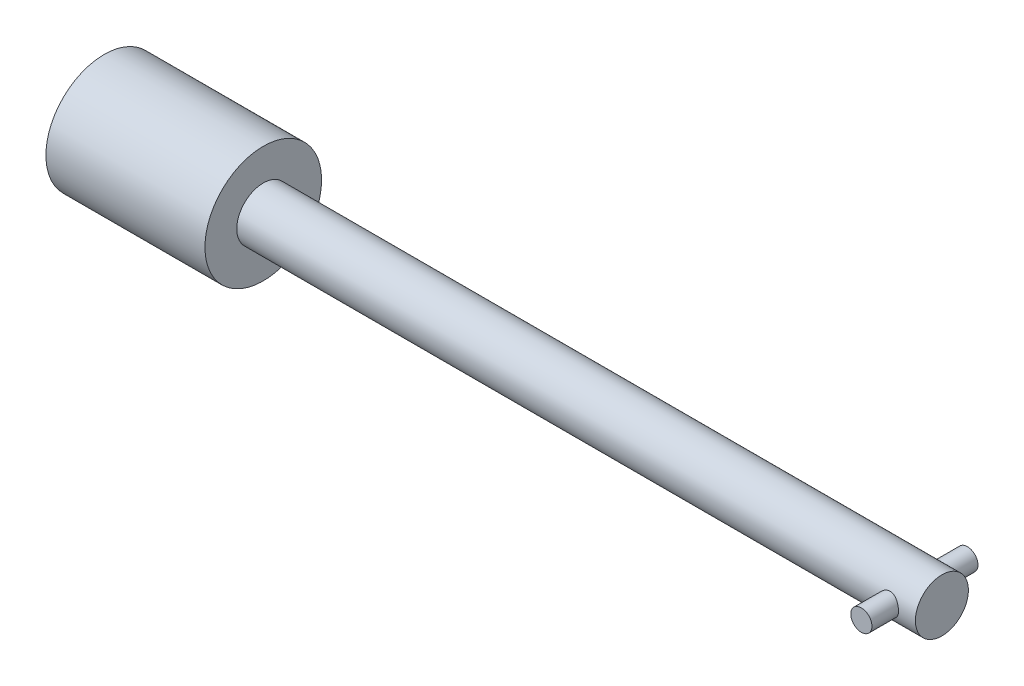
ISO-10303-21;
HEADER;
FILE_DESCRIPTION(('STEP AP214'),'2;1');
FILE_NAME('part.step','',(''),(''),'','','');
FILE_SCHEMA(('AUTOMOTIVE_DESIGN { 1 0 10303 214 1 1 1 1 }'));
ENDSEC;
DATA;
#1=APPLICATION_CONTEXT('core data for automotive mechanical design processes');
#2=APPLICATION_PROTOCOL_DEFINITION('international standard','automotive_design',2000,#1);
#3=PRODUCT_CONTEXT('',#1,'mechanical');
#4=PRODUCT('Part','Part','',(#3));
#5=PRODUCT_RELATED_PRODUCT_CATEGORY('part','',(#4));
#6=PRODUCT_DEFINITION_FORMATION('','',#4);
#7=PRODUCT_DEFINITION_CONTEXT('part definition',#1,'design');
#8=PRODUCT_DEFINITION('design','',#6,#7);
#9=PRODUCT_DEFINITION_SHAPE('','',#8);
#10=(LENGTH_UNIT() NAMED_UNIT(*) SI_UNIT(.MILLI.,.METRE.));
#11=(NAMED_UNIT(*) PLANE_ANGLE_UNIT() SI_UNIT($,.RADIAN.));
#12=(NAMED_UNIT(*) SI_UNIT($,.STERADIAN.) SOLID_ANGLE_UNIT());
#13=UNCERTAINTY_MEASURE_WITH_UNIT(LENGTH_MEASURE(1.E-05),#10,'distance_accuracy_value','');
#14=(GEOMETRIC_REPRESENTATION_CONTEXT(3) GLOBAL_UNCERTAINTY_ASSIGNED_CONTEXT((#13)) GLOBAL_UNIT_ASSIGNED_CONTEXT((#10,
#11,#12)) REPRESENTATION_CONTEXT('',''));
#15=CARTESIAN_POINT('',(0.,0.,0.));
#16=DIRECTION('',(0.,0.,1.));
#17=DIRECTION('',(1.,0.,0.));
#18=AXIS2_PLACEMENT_3D('',#15,#16,#17);
#19=CARTESIAN_POINT('',(15.,0.,0.));
#20=DIRECTION('',(-1.,0.,0.));
#21=DIRECTION('',(0.,0.,1.));
#22=AXIS2_PLACEMENT_3D('',#19,#20,#21);
#23=CYLINDRICAL_SURFACE('',#22,5.5);
#24=CARTESIAN_POINT('',(15.,0.,0.));
#25=DIRECTION('',(1.,0.,0.));
#26=DIRECTION('',(0.,0.,-1.));
#27=AXIS2_PLACEMENT_3D('',#24,#25,#26);
#28=CIRCLE('',#27,5.5);
#29=CARTESIAN_POINT('',(15.,0.,-5.5));
#30=VERTEX_POINT('',#29);
#31=EDGE_CURVE('E10',#30,#30,#28,.T.);
#32=ORIENTED_EDGE('',*,*,#31,.F.);
#33=EDGE_LOOP('',(#32));
#34=FACE_BOUND('',#33,.T.);
#35=CARTESIAN_POINT('',(0.,0.,0.));
#36=DIRECTION('',(1.,0.,0.));
#37=DIRECTION('',(0.,0.,-1.));
#38=AXIS2_PLACEMENT_3D('',#35,#36,#37);
#39=CIRCLE('',#38,5.5);
#40=CARTESIAN_POINT('',(0.,0.,-5.5));
#41=VERTEX_POINT('',#40);
#42=EDGE_CURVE('E42',#41,#41,#39,.T.);
#43=ORIENTED_EDGE('',*,*,#42,.T.);
#44=EDGE_LOOP('',(#43));
#45=FACE_BOUND('',#44,.T.);
#46=ADVANCED_FACE('F31',(#34,#45),#23,.T.);
#47=CARTESIAN_POINT('',(15.,0.,0.));
#48=DIRECTION('',(1.,0.,0.));
#49=DIRECTION('',(0.,0.,-1.));
#50=AXIS2_PLACEMENT_3D('',#47,#48,#49);
#51=PLANE('',#50);
#52=CARTESIAN_POINT('',(15.,0.,0.));
#53=DIRECTION('',(1.,0.,0.));
#54=DIRECTION('',(0.,0.,-1.));
#55=AXIS2_PLACEMENT_3D('',#52,#53,#54);
#56=CIRCLE('',#55,2.5);
#57=CARTESIAN_POINT('',(15.,0.,-2.5));
#58=VERTEX_POINT('',#57);
#59=EDGE_CURVE('E50',#58,#58,#56,.T.);
#60=ORIENTED_EDGE('',*,*,#59,.F.);
#61=EDGE_LOOP('',(#60));
#62=FACE_BOUND('',#61,.T.);
#63=ORIENTED_EDGE('',*,*,#31,.T.);
#64=EDGE_LOOP('',(#63));
#65=FACE_BOUND('',#64,.T.);
#66=ADVANCED_FACE('F89',(#62,#65),#51,.T.);
#67=CARTESIAN_POINT('',(0.,0.,0.));
#68=DIRECTION('',(1.,0.,0.));
#69=DIRECTION('',(0.,0.,-1.));
#70=AXIS2_PLACEMENT_3D('',#67,#68,#69);
#71=PLANE('',#70);
#72=CARTESIAN_POINT('',(0.,0.,0.));
#73=DIRECTION('',(-1.,0.,0.));
#74=DIRECTION('',(0.,0.,1.));
#75=AXIS2_PLACEMENT_3D('',#72,#73,#74);
#76=CIRCLE('',#75,2.5);
#77=CARTESIAN_POINT('',(0.,0.,2.5));
#78=VERTEX_POINT('',#77);
#79=EDGE_CURVE('E104',#78,#78,#76,.T.);
#80=ORIENTED_EDGE('',*,*,#79,.F.);
#81=EDGE_LOOP('',(#80));
#82=FACE_BOUND('',#81,.T.);
#83=ORIENTED_EDGE('',*,*,#42,.F.);
#84=EDGE_LOOP('',(#83));
#85=FACE_BOUND('',#84,.T.);
#86=ADVANCED_FACE('F85',(#82,#85),#71,.F.);
#87=CARTESIAN_POINT('',(79.,0.,0.));
#88=DIRECTION('',(-1.,0.,0.));
#89=DIRECTION('',(0.,0.,1.));
#90=AXIS2_PLACEMENT_3D('',#87,#88,#89);
#91=CYLINDRICAL_SURFACE('',#90,2.5);
#92=CARTESIAN_POINT('',(77.4052586538018,0.,2.5));
#93=CARTESIAN_POINT('',(77.4052537278899,-0.0537465027214461,2.49999635613542));
#94=CARTESIAN_POINT('',(77.4008997777576,-0.107586282045338,2.49824647153466));
#95=CARTESIAN_POINT('',(77.3836348020411,-0.213748240208949,2.49141726550321));
#96=CARTESIAN_POINT('',(77.3707005142587,-0.266065888780624,2.48632889349439));
#97=CARTESIAN_POINT('',(77.3368206147723,-0.367476961363702,2.47337104606559));
#98=CARTESIAN_POINT('',(77.3159012306934,-0.416580330808481,2.46551068182036));
#99=CARTESIAN_POINT('',(77.2667490671385,-0.510535985164184,2.44778305398039));
#100=CARTESIAN_POINT('',(77.2385188263423,-0.555389738375494,2.43791648729028));
#101=CARTESIAN_POINT('',(77.1741409045213,-0.641750503785193,2.41665443085209));
#102=CARTESIAN_POINT('',(77.1377053256816,-0.683031136275103,2.40521148464595));
#103=CARTESIAN_POINT('',(77.0585586520634,-0.759087502392358,2.38230288453097));
#104=CARTESIAN_POINT('',(77.0158445051959,-0.793860053566764,2.37083722226896));
#105=CARTESIAN_POINT('',(76.9230446186806,-0.857437283646437,2.34861395898568));
#106=CARTESIAN_POINT('',(76.8727154107902,-0.885907490597732,2.33791057982476));
#107=CARTESIAN_POINT('',(76.7674904545918,-0.933877359518572,2.31916823593396));
#108=CARTESIAN_POINT('',(76.7125968898776,-0.953381282142917,2.31112800622088));
#109=CARTESIAN_POINT('',(76.6024024870057,-0.981949411697934,2.29913178830409));
#110=CARTESIAN_POINT('',(76.5472330360137,-0.991446982902823,2.29500710177802));
#111=CARTESIAN_POINT('',(76.4359411546481,-1.00108648082001,2.29082002024572));
#112=CARTESIAN_POINT('',(76.3798192064893,-1.00123300815661,2.29075562761384));
#113=CARTESIAN_POINT('',(76.2723803180728,-0.992494683752272,2.29455250139997));
#114=CARTESIAN_POINT('',(76.2210007965973,-0.984237657152569,2.29814087519225));
#115=CARTESIAN_POINT('',(76.1204288757984,-0.959973440148911,2.30838093803918));
#116=CARTESIAN_POINT('',(76.0712368597466,-0.943964897402317,2.31503316160836));
#117=CARTESIAN_POINT('',(75.9752497357038,-0.904347366275538,2.33079742544265));
#118=CARTESIAN_POINT('',(75.9285240342744,-0.880589931157659,2.33995689640394));
#119=CARTESIAN_POINT('',(75.839550745621,-0.826253230366107,2.35969058194945));
#120=CARTESIAN_POINT('',(75.7973048491004,-0.795671402550421,2.37026532728424));
#121=CARTESIAN_POINT('',(75.7150537894008,-0.725775299727219,2.39263368371135));
#122=CARTESIAN_POINT('',(75.6754742890788,-0.685968731485325,2.40445832488076));
#123=CARTESIAN_POINT('',(75.6034164148008,-0.600157213715106,2.42729912479141));
#124=CARTESIAN_POINT('',(75.5709394550966,-0.554151032667224,2.43831512222662));
#125=CARTESIAN_POINT('',(75.5134499300939,-0.456038826302925,2.45857340632274));
#126=CARTESIAN_POINT('',(75.4885975132032,-0.403830245673242,2.46777635047707));
#127=CARTESIAN_POINT('',(75.4481747232627,-0.295511882741444,2.48307414164379));
#128=CARTESIAN_POINT('',(75.4325996350231,-0.239404098424839,2.48917056731191));
#129=CARTESIAN_POINT('',(75.4120345060919,-0.128447943803912,2.49728069753455));
#130=CARTESIAN_POINT('',(75.406472426675,-0.0737216469927696,2.49951472916757));
#131=CARTESIAN_POINT('',(75.4044021035375,0.0359226549039061,2.50034239255315));
#132=CARTESIAN_POINT('',(75.407891513028,0.0908406066119593,2.49893696791146));
#133=CARTESIAN_POINT('',(75.4234045300778,0.196716369560992,2.49278783531877));
#134=CARTESIAN_POINT('',(75.4350376439773,0.247741245887736,2.48819695672762));
#135=CARTESIAN_POINT('',(75.4659765079567,0.347067714030389,2.4762972070275));
#136=CARTESIAN_POINT('',(75.4852832436361,0.395368955112421,2.46898798678265));
#137=CARTESIAN_POINT('',(75.5316511236417,0.48953939290835,2.45208297385406));
#138=CARTESIAN_POINT('',(75.5589313898233,0.535289011377703,2.44242407989902));
#139=CARTESIAN_POINT('',(75.6202288157546,0.621721795623279,2.42186682372762));
#140=CARTESIAN_POINT('',(75.6542486752631,0.662402920380564,2.41096796555135));
#141=CARTESIAN_POINT('',(75.7306936602766,0.740361521514414,2.38822558819056));
#142=CARTESIAN_POINT('',(75.7735254245549,0.777236966903039,2.37636720712526));
#143=CARTESIAN_POINT('',(75.8649786953065,0.84337559870686,2.35370836458566));
#144=CARTESIAN_POINT('',(75.9136011539718,0.872637530668756,2.34290807763255));
#145=CARTESIAN_POINT('',(76.0159895010988,0.922903750965813,2.32357149953854));
#146=CARTESIAN_POINT('',(76.0698006534079,0.943825297267227,2.31505815442394));
#147=CARTESIAN_POINT('',(76.1806254796593,0.976148109852651,2.30161836738966));
#148=CARTESIAN_POINT('',(76.237636756708,0.987556402634655,2.29668927847999));
#149=CARTESIAN_POINT('',(76.348822604689,0.999857808639198,2.29135879649963));
#150=CARTESIAN_POINT('',(76.4029060735984,1.00144854115143,2.29065710504086));
#151=CARTESIAN_POINT('',(76.5105310826584,0.99590157963876,2.29307418016549));
#152=CARTESIAN_POINT('',(76.5640726907531,0.98876499395689,2.29619246162397));
#153=CARTESIAN_POINT('',(76.6669247487293,0.966535683076823,2.3056332453951));
#154=CARTESIAN_POINT('',(76.7163187910183,0.951768746785486,2.31182415913725));
#155=CARTESIAN_POINT('',(76.8119479686085,0.915002724245506,2.32662000616348));
#156=CARTESIAN_POINT('',(76.8581822272517,0.893001640696909,2.33522560603003));
#157=CARTESIAN_POINT('',(76.9490634634371,0.84093638137987,2.35449304802246));
#158=CARTESIAN_POINT('',(76.993467988867,0.810482667579748,2.36524441156621));
#159=CARTESIAN_POINT('',(77.0767553124036,0.742946059635752,2.38731902186118));
#160=CARTESIAN_POINT('',(77.1156364398659,0.705861167409066,2.39864244024203));
#161=CARTESIAN_POINT('',(77.1893600804336,0.623252753136235,2.42146783543697));
#162=CARTESIAN_POINT('',(77.2237773072508,0.57733800057307,2.43293378981093));
#163=CARTESIAN_POINT('',(77.2844271751126,0.479950160142891,2.45400203356858));
#164=CARTESIAN_POINT('',(77.310656009878,0.428474502273623,2.46360345546453));
#165=CARTESIAN_POINT('',(77.3535697613969,0.322369031247607,2.47969857407931));
#166=CARTESIAN_POINT('',(77.3704233155819,0.267815809109851,2.48624681527514));
#167=CARTESIAN_POINT('',(77.3945782142789,0.156438273140612,2.49572153104683));
#168=CARTESIAN_POINT('',(77.4019098721737,0.0996217629294578,2.49865949747819));
#169=CARTESIAN_POINT('',(77.4049563442909,0.0284561489454659,2.49987949752068));
#170=CARTESIAN_POINT('',(77.4052599581164,0.0142313443703797,2.50000096484588));
#171=CARTESIAN_POINT('',(77.4052586538018,0.,2.5));
#172=B_SPLINE_CURVE_WITH_KNOTS('',3,(#92,#93,#94,#95,#96,#97,#98,#99,#100,#101,#102,#103,#104,
#105,#106,#107,#108,#109,#110,#111,#112,#113,#114,#115,#116,#117,#118,#119,#120,#121,#122,#123,
#124,#125,#126,#127,#128,#129,#130,#131,#132,#133,#134,#135,#136,#137,#138,#139,#140,#141,#142,
#143,#144,#145,#146,#147,#148,#149,#150,#151,#152,#153,#154,#155,#156,#157,#158,#159,#160,#161,
#162,#163,#164,#165,#166,#167,#168,#169,#170,#171),.UNSPECIFIED.,.T.,.F.,(4,2,2,2,2,2,2,2,2,2,2,
2,2,2,2,2,2,2,2,2,2,2,2,2,2,2,2,2,2,2,2,2,2,2,2,2,2,2,2,4),(0.,0.161201493946536,
0.322841818003967,0.483955728735794,0.645013767839919,0.812986908501986,0.98104197467205,
1.15657629409608,1.33202711559134,1.49952052654415,1.66693153170242,1.82269164200685,
1.97847893628023,2.13744563149407,2.29647210969091,2.46779174593277,2.63914546419865,
2.81388456581402,2.98853478056894,3.15284592264003,3.3171144678504,3.47400227782182,
3.63091024496897,3.79261756699131,3.95438979749484,4.12684237312208,4.29932334521874,
4.47347522570414,4.64749836322965,4.80899836696373,4.97047786281522,5.12557159274383,
5.28070817902579,5.44472734028344,5.60879600674195,5.78350211766917,5.95828931820265,
6.12982150506658,6.3008062620217,6.34349022948397),.UNSPECIFIED.);
#173=CARTESIAN_POINT('',(77.4052586538018,0.,2.5));
#174=VERTEX_POINT('',#173);
#175=EDGE_CURVE('E34',#174,#174,#172,.T.);
#176=ORIENTED_EDGE('',*,*,#175,.T.);
#177=EDGE_LOOP('',(#176));
#178=FACE_BOUND('',#177,.T.);
#179=CARTESIAN_POINT('',(77.4052586538018,0.,-2.5));
#180=CARTESIAN_POINT('',(77.4052537278899,0.0537465027214461,-2.49999635613542));
#181=CARTESIAN_POINT('',(77.4008997777576,0.107586282045338,-2.49824647153466));
#182=CARTESIAN_POINT('',(77.3836348020411,0.213748240208949,-2.49141726550321));
#183=CARTESIAN_POINT('',(77.3707005142587,0.266065888780624,-2.48632889349439));
#184=CARTESIAN_POINT('',(77.3368206147723,0.367476961363702,-2.47337104606559));
#185=CARTESIAN_POINT('',(77.3159012306934,0.416580330808481,-2.46551068182036));
#186=CARTESIAN_POINT('',(77.2667490671385,0.510535985164184,-2.44778305398039));
#187=CARTESIAN_POINT('',(77.2385188263423,0.555389738375494,-2.43791648729028));
#188=CARTESIAN_POINT('',(77.1741409045213,0.641750503785193,-2.41665443085209));
#189=CARTESIAN_POINT('',(77.1377053256816,0.683031136275103,-2.40521148464595));
#190=CARTESIAN_POINT('',(77.0585586520634,0.759087502392358,-2.38230288453097));
#191=CARTESIAN_POINT('',(77.0158445051959,0.793860053566764,-2.37083722226896));
#192=CARTESIAN_POINT('',(76.9230446186806,0.857437283646437,-2.34861395898568));
#193=CARTESIAN_POINT('',(76.8727154107902,0.885907490597732,-2.33791057982476));
#194=CARTESIAN_POINT('',(76.7674904545918,0.933877359518572,-2.31916823593396));
#195=CARTESIAN_POINT('',(76.7125968898776,0.953381282142917,-2.31112800622088));
#196=CARTESIAN_POINT('',(76.6024024870057,0.981949411697934,-2.29913178830409));
#197=CARTESIAN_POINT('',(76.5472330360137,0.991446982902823,-2.29500710177802));
#198=CARTESIAN_POINT('',(76.4359411546481,1.00108648082001,-2.29082002024572));
#199=CARTESIAN_POINT('',(76.3798192064893,1.00123300815661,-2.29075562761384));
#200=CARTESIAN_POINT('',(76.2723803180728,0.992494683752272,-2.29455250139997));
#201=CARTESIAN_POINT('',(76.2210007965973,0.984237657152569,-2.29814087519225));
#202=CARTESIAN_POINT('',(76.1204288757984,0.959973440148911,-2.30838093803918));
#203=CARTESIAN_POINT('',(76.0712368597466,0.943964897402317,-2.31503316160836));
#204=CARTESIAN_POINT('',(75.9752497357038,0.904347366275538,-2.33079742544265));
#205=CARTESIAN_POINT('',(75.9285240342744,0.880589931157659,-2.33995689640394));
#206=CARTESIAN_POINT('',(75.839550745621,0.826253230366107,-2.35969058194945));
#207=CARTESIAN_POINT('',(75.7973048491004,0.795671402550421,-2.37026532728424));
#208=CARTESIAN_POINT('',(75.7150537894008,0.725775299727219,-2.39263368371135));
#209=CARTESIAN_POINT('',(75.6754742890788,0.685968731485325,-2.40445832488076));
#210=CARTESIAN_POINT('',(75.6034164148008,0.600157213715106,-2.42729912479141));
#211=CARTESIAN_POINT('',(75.5709394550966,0.554151032667224,-2.43831512222662));
#212=CARTESIAN_POINT('',(75.5134499300939,0.456038826302925,-2.45857340632274));
#213=CARTESIAN_POINT('',(75.4885975132032,0.403830245673242,-2.46777635047707));
#214=CARTESIAN_POINT('',(75.4481747232627,0.295511882741444,-2.48307414164379));
#215=CARTESIAN_POINT('',(75.4325996350231,0.239404098424839,-2.48917056731191));
#216=CARTESIAN_POINT('',(75.4120345060919,0.128447943803912,-2.49728069753455));
#217=CARTESIAN_POINT('',(75.406472426675,0.0737216469927696,-2.49951472916757));
#218=CARTESIAN_POINT('',(75.4044021035375,-0.0359226549039061,-2.50034239255315));
#219=CARTESIAN_POINT('',(75.407891513028,-0.0908406066119593,-2.49893696791146));
#220=CARTESIAN_POINT('',(75.4234045300778,-0.196716369560992,-2.49278783531877));
#221=CARTESIAN_POINT('',(75.4350376439773,-0.247741245887736,-2.48819695672762));
#222=CARTESIAN_POINT('',(75.4659765079567,-0.347067714030389,-2.4762972070275));
#223=CARTESIAN_POINT('',(75.4852832436361,-0.395368955112421,-2.46898798678265));
#224=CARTESIAN_POINT('',(75.5316511236417,-0.48953939290835,-2.45208297385406));
#225=CARTESIAN_POINT('',(75.5589313898233,-0.535289011377703,-2.44242407989902));
#226=CARTESIAN_POINT('',(75.6202288157546,-0.621721795623279,-2.42186682372762));
#227=CARTESIAN_POINT('',(75.6542486752631,-0.662402920380564,-2.41096796555135));
#228=CARTESIAN_POINT('',(75.7306936602766,-0.740361521514414,-2.38822558819056));
#229=CARTESIAN_POINT('',(75.7735254245549,-0.777236966903039,-2.37636720712526));
#230=CARTESIAN_POINT('',(75.8649786953065,-0.84337559870686,-2.35370836458566));
#231=CARTESIAN_POINT('',(75.9136011539718,-0.872637530668756,-2.34290807763255));
#232=CARTESIAN_POINT('',(76.0159895010988,-0.922903750965813,-2.32357149953854));
#233=CARTESIAN_POINT('',(76.0698006534079,-0.943825297267227,-2.31505815442394));
#234=CARTESIAN_POINT('',(76.1806254796593,-0.976148109852651,-2.30161836738966));
#235=CARTESIAN_POINT('',(76.237636756708,-0.987556402634655,-2.29668927847999));
#236=CARTESIAN_POINT('',(76.348822604689,-0.999857808639198,-2.29135879649963));
#237=CARTESIAN_POINT('',(76.4029060735984,-1.00144854115143,-2.29065710504086));
#238=CARTESIAN_POINT('',(76.5105310826584,-0.99590157963876,-2.29307418016549));
#239=CARTESIAN_POINT('',(76.5640726907531,-0.98876499395689,-2.29619246162397));
#240=CARTESIAN_POINT('',(76.6669247487293,-0.966535683076823,-2.3056332453951));
#241=CARTESIAN_POINT('',(76.7163187910183,-0.951768746785486,-2.31182415913725));
#242=CARTESIAN_POINT('',(76.8119479686085,-0.915002724245506,-2.32662000616348));
#243=CARTESIAN_POINT('',(76.8581822272517,-0.893001640696909,-2.33522560603003));
#244=CARTESIAN_POINT('',(76.9490634634371,-0.84093638137987,-2.35449304802246));
#245=CARTESIAN_POINT('',(76.993467988867,-0.810482667579748,-2.36524441156621));
#246=CARTESIAN_POINT('',(77.0767553124036,-0.742946059635752,-2.38731902186118));
#247=CARTESIAN_POINT('',(77.1156364398659,-0.705861167409066,-2.39864244024203));
#248=CARTESIAN_POINT('',(77.1893600804336,-0.623252753136235,-2.42146783543697));
#249=CARTESIAN_POINT('',(77.2237773072508,-0.57733800057307,-2.43293378981093));
#250=CARTESIAN_POINT('',(77.2844271751126,-0.479950160142891,-2.45400203356858));
#251=CARTESIAN_POINT('',(77.310656009878,-0.428474502273623,-2.46360345546453));
#252=CARTESIAN_POINT('',(77.3535697613969,-0.322369031247607,-2.47969857407931));
#253=CARTESIAN_POINT('',(77.3704233155819,-0.267815809109851,-2.48624681527514));
#254=CARTESIAN_POINT('',(77.3945782142789,-0.156438273140612,-2.49572153104683));
#255=CARTESIAN_POINT('',(77.4019098721737,-0.0996217629294578,-2.49865949747819));
#256=CARTESIAN_POINT('',(77.4049563442909,-0.0284561489454659,-2.49987949752068));
#257=CARTESIAN_POINT('',(77.4052599581164,-0.0142313443703797,-2.50000096484588));
#258=CARTESIAN_POINT('',(77.4052586538018,0.,-2.5));
#259=B_SPLINE_CURVE_WITH_KNOTS('',3,(#179,#180,#181,#182,#183,#184,#185,#186,#187,#188,#189,
#190,#191,#192,#193,#194,#195,#196,#197,#198,#199,#200,#201,#202,#203,#204,#205,#206,#207,#208,
#209,#210,#211,#212,#213,#214,#215,#216,#217,#218,#219,#220,#221,#222,#223,#224,#225,#226,#227,
#228,#229,#230,#231,#232,#233,#234,#235,#236,#237,#238,#239,#240,#241,#242,#243,#244,#245,#246,
#247,#248,#249,#250,#251,#252,#253,#254,#255,#256,#257,#258),.UNSPECIFIED.,.T.,.F.,(4,2,2,2,2,2,
2,2,2,2,2,2,2,2,2,2,2,2,2,2,2,2,2,2,2,2,2,2,2,2,2,2,2,2,2,2,2,2,2,4),(0.,0.161201493946536,
0.322841818003967,0.483955728735794,0.645013767839919,0.812986908501986,0.98104197467205,
1.15657629409608,1.33202711559134,1.49952052654415,1.66693153170242,1.82269164200685,
1.97847893628023,2.13744563149407,2.29647210969091,2.46779174593277,2.63914546419865,
2.81388456581402,2.98853478056894,3.15284592264003,3.3171144678504,3.47400227782182,
3.63091024496897,3.79261756699131,3.95438979749484,4.12684237312208,4.29932334521874,
4.47347522570414,4.64749836322965,4.80899836696373,4.97047786281522,5.12557159274383,
5.28070817902579,5.44472734028344,5.60879600674195,5.78350211766917,5.95828931820265,
6.12982150506658,6.3008062620217,6.34349022948397),.UNSPECIFIED.);
#260=CARTESIAN_POINT('',(77.4052586538018,0.,-2.5));
#261=VERTEX_POINT('',#260);
#262=EDGE_CURVE('E52',#261,#261,#259,.T.);
#263=ORIENTED_EDGE('',*,*,#262,.T.);
#264=EDGE_LOOP('',(#263));
#265=FACE_BOUND('',#264,.T.);
#266=CARTESIAN_POINT('',(79.,0.,0.));
#267=DIRECTION('',(1.,0.,0.));
#268=DIRECTION('',(0.,0.,-1.));
#269=AXIS2_PLACEMENT_3D('',#266,#267,#268);
#270=CIRCLE('',#269,2.5);
#271=CARTESIAN_POINT('',(79.,0.,-2.5));
#272=VERTEX_POINT('',#271);
#273=EDGE_CURVE('E47',#272,#272,#270,.T.);
#274=ORIENTED_EDGE('',*,*,#273,.F.);
#275=EDGE_LOOP('',(#274));
#276=FACE_BOUND('',#275,.T.);
#277=ORIENTED_EDGE('',*,*,#59,.T.);
#278=EDGE_LOOP('',(#277));
#279=FACE_BOUND('',#278,.T.);
#280=ADVANCED_FACE('F57',(#178,#265,#276,#279),#91,.T.);
#281=CARTESIAN_POINT('',(79.,0.,0.));
#282=DIRECTION('',(1.,0.,0.));
#283=DIRECTION('',(0.,0.,-1.));
#284=AXIS2_PLACEMENT_3D('',#281,#282,#283);
#285=PLANE('',#284);
#286=ORIENTED_EDGE('',*,*,#273,.T.);
#287=EDGE_LOOP('',(#286));
#288=FACE_BOUND('',#287,.T.);
#289=ADVANCED_FACE('F78',(#288),#285,.T.);
#290=CARTESIAN_POINT('',(8.,0.,0.));
#291=DIRECTION('',(-1.,0.,0.));
#292=DIRECTION('',(0.,0.,1.));
#293=AXIS2_PLACEMENT_3D('',#290,#291,#292);
#294=CYLINDRICAL_SURFACE('',#293,2.5);
#295=CARTESIAN_POINT('',(8.,0.,0.));
#296=DIRECTION('',(-1.,0.,0.));
#297=DIRECTION('',(0.,0.,1.));
#298=AXIS2_PLACEMENT_3D('',#295,#296,#297);
#299=CIRCLE('',#298,2.5);
#300=CARTESIAN_POINT('',(8.,0.,2.5));
#301=VERTEX_POINT('',#300);
#302=EDGE_CURVE('E106',#301,#301,#299,.T.);
#303=ORIENTED_EDGE('',*,*,#302,.F.);
#304=EDGE_LOOP('',(#303));
#305=FACE_BOUND('',#304,.T.);
#306=ORIENTED_EDGE('',*,*,#79,.T.);
#307=EDGE_LOOP('',(#306));
#308=FACE_BOUND('',#307,.T.);
#309=ADVANCED_FACE('F75',(#305,#308),#294,.F.);
#310=CARTESIAN_POINT('',(8.,0.,0.));
#311=DIRECTION('',(-1.,0.,0.));
#312=DIRECTION('',(0.,0.,1.));
#313=AXIS2_PLACEMENT_3D('',#310,#311,#312);
#314=PLANE('',#313);
#315=ORIENTED_EDGE('',*,*,#302,.T.);
#316=EDGE_LOOP('',(#315));
#317=FACE_BOUND('',#316,.T.);
#318=ADVANCED_FACE('F71',(#317),#314,.T.);
#319=CARTESIAN_POINT('',(76.4052586538018,0.,-5.));
#320=DIRECTION('',(0.,0.,1.));
#321=DIRECTION('',(1.,0.,0.));
#322=AXIS2_PLACEMENT_3D('',#319,#320,#321);
#323=PLANE('',#322);
#324=CARTESIAN_POINT('',(76.4052586538018,0.,-5.));
#325=DIRECTION('',(0.,0.,1.));
#326=DIRECTION('',(1.,0.,0.));
#327=AXIS2_PLACEMENT_3D('',#324,#325,#326);
#328=CIRCLE('',#327,0.999999999999998);
#329=CARTESIAN_POINT('',(77.4052586538018,0.,-5.));
#330=VERTEX_POINT('',#329);
#331=EDGE_CURVE('E56',#330,#330,#328,.T.);
#332=ORIENTED_EDGE('',*,*,#331,.F.);
#333=EDGE_LOOP('',(#332));
#334=FACE_BOUND('',#333,.T.);
#335=ADVANCED_FACE('F69',(#334),#323,.F.);
#336=CARTESIAN_POINT('',(76.4052586538018,0.,-5.));
#337=DIRECTION('',(0.,0.,1.));
#338=DIRECTION('',(1.,0.,0.));
#339=AXIS2_PLACEMENT_3D('',#336,#337,#338);
#340=CYLINDRICAL_SURFACE('',#339,0.999999999999998);
#341=ORIENTED_EDGE('',*,*,#331,.T.);
#342=EDGE_LOOP('',(#341));
#343=FACE_BOUND('',#342,.T.);
#344=ORIENTED_EDGE('',*,*,#262,.F.);
#345=EDGE_LOOP('',(#344));
#346=FACE_BOUND('',#345,.T.);
#347=ADVANCED_FACE('F67',(#343,#346),#340,.T.);
#348=CARTESIAN_POINT('',(76.4052586538018,0.,5.));
#349=DIRECTION('',(0.,0.,1.));
#350=DIRECTION('',(1.,0.,0.));
#351=AXIS2_PLACEMENT_3D('',#348,#349,#350);
#352=CIRCLE('',#351,0.999999999999998);
#353=CARTESIAN_POINT('',(77.4052586538018,0.,5.));
#354=VERTEX_POINT('',#353);
#355=EDGE_CURVE('E119',#354,#354,#352,.T.);
#356=ORIENTED_EDGE('',*,*,#355,.F.);
#357=EDGE_LOOP('',(#356));
#358=FACE_BOUND('',#357,.T.);
#359=ORIENTED_EDGE('',*,*,#175,.F.);
#360=EDGE_LOOP('',(#359));
#361=FACE_BOUND('',#360,.T.);
#362=ADVANCED_FACE('F61',(#358,#361),#340,.T.);
#363=CARTESIAN_POINT('',(76.4052586538018,0.,5.));
#364=DIRECTION('',(0.,0.,1.));
#365=DIRECTION('',(1.,0.,0.));
#366=AXIS2_PLACEMENT_3D('',#363,#364,#365);
#367=PLANE('',#366);
#368=ORIENTED_EDGE('',*,*,#355,.T.);
#369=EDGE_LOOP('',(#368));
#370=FACE_BOUND('',#369,.T.);
#371=ADVANCED_FACE('F66',(#370),#367,.T.);
#372=CLOSED_SHELL('',(#46,#66,#86,#280,#289,#309,#318,#335,#347,#362,#371));
#373=MANIFOLD_SOLID_BREP('B2',#372);
#374=ADVANCED_BREP_SHAPE_REPRESENTATION('',(#18,#373),#14);
#375=SHAPE_DEFINITION_REPRESENTATION(#9,#374);
ENDSEC;
END-ISO-10303-21;
